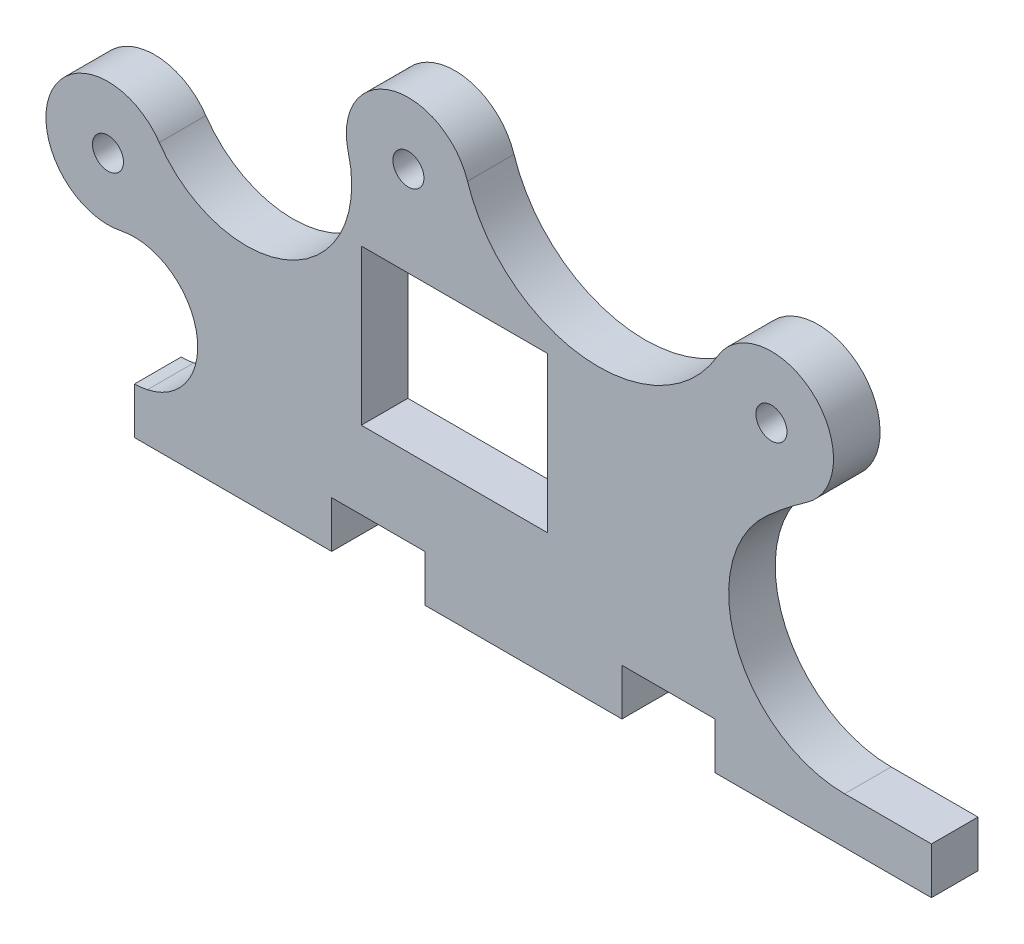
ISO-10303-21;
HEADER;
FILE_DESCRIPTION(('STEP AP214'),'2;1');
FILE_NAME('part.step','',(''),(''),'','','');
FILE_SCHEMA(('AUTOMOTIVE_DESIGN { 1 0 10303 214 1 1 1 1 }'));
ENDSEC;
DATA;
#1=APPLICATION_CONTEXT('core data for automotive mechanical design processes');
#2=APPLICATION_PROTOCOL_DEFINITION('international standard','automotive_design',2000,#1);
#3=PRODUCT_CONTEXT('',#1,'mechanical');
#4=PRODUCT('Part','Part','',(#3));
#5=PRODUCT_RELATED_PRODUCT_CATEGORY('part','',(#4));
#6=PRODUCT_DEFINITION_FORMATION('','',#4);
#7=PRODUCT_DEFINITION_CONTEXT('part definition',#1,'design');
#8=PRODUCT_DEFINITION('design','',#6,#7);
#9=PRODUCT_DEFINITION_SHAPE('','',#8);
#10=(LENGTH_UNIT() NAMED_UNIT(*) SI_UNIT(.MILLI.,.METRE.));
#11=(NAMED_UNIT(*) PLANE_ANGLE_UNIT() SI_UNIT($,.RADIAN.));
#12=(NAMED_UNIT(*) SI_UNIT($,.STERADIAN.) SOLID_ANGLE_UNIT());
#13=UNCERTAINTY_MEASURE_WITH_UNIT(LENGTH_MEASURE(1.E-05),#10,'distance_accuracy_value','');
#14=(GEOMETRIC_REPRESENTATION_CONTEXT(3) GLOBAL_UNCERTAINTY_ASSIGNED_CONTEXT((#13)) GLOBAL_UNIT_ASSIGNED_CONTEXT((#10,
#11,#12)) REPRESENTATION_CONTEXT('',''));
#15=CARTESIAN_POINT('',(0.,0.,0.));
#16=DIRECTION('',(0.,0.,1.));
#17=DIRECTION('',(1.,0.,0.));
#18=AXIS2_PLACEMENT_3D('',#15,#16,#17);
#19=CARTESIAN_POINT('',(-33.1668064947985,-1.04329319568763,-70.1366701519255));
#20=DIRECTION('',(0.,1.,0.));
#21=DIRECTION('',(0.,0.,1.));
#22=AXIS2_PLACEMENT_3D('',#19,#20,#21);
#23=PLANE('',#22);
#24=DIRECTION('',(-1.,0.,0.));
#25=VECTOR('',#24,1.);
#26=CARTESIAN_POINT('',(-33.1668064947985,-1.04329319568763,3.));
#27=LINE('',#26,#25);
#28=CARTESIAN_POINT('',(-4.30680649479845,-1.04329319568763,3.));
#29=VERTEX_POINT('',#28);
#30=CARTESIAN_POINT('',(-17.0068064947985,-1.04329319568765,3.));
#31=VERTEX_POINT('',#30);
#32=EDGE_CURVE('E286',#29,#31,#27,.T.);
#33=ORIENTED_EDGE('',*,*,#32,.T.);
#34=DIRECTION('',(0.,0.,1.));
#35=VECTOR('',#34,1.);
#36=CARTESIAN_POINT('',(-17.0068064947985,-1.04329319568765,-6.70820393249937));
#37=LINE('',#36,#35);
#38=CARTESIAN_POINT('',(-17.0068064947985,-1.04329319568763,0.));
#39=VERTEX_POINT('',#38);
#40=EDGE_CURVE('E293',#39,#31,#37,.T.);
#41=ORIENTED_EDGE('',*,*,#40,.F.);
#42=DIRECTION('',(1.,0.,0.));
#43=VECTOR('',#42,1.);
#44=CARTESIAN_POINT('',(-33.1668064947985,-1.04329319568763,0.));
#45=LINE('',#44,#43);
#46=CARTESIAN_POINT('',(-4.30680649479845,-1.04329319568763,0.));
#47=VERTEX_POINT('',#46);
#48=EDGE_CURVE('E349',#39,#47,#45,.T.);
#49=ORIENTED_EDGE('',*,*,#48,.T.);
#50=DIRECTION('',(0.,0.,1.));
#51=VECTOR('',#50,1.);
#52=CARTESIAN_POINT('',(-4.30680649479845,-1.04329319568763,-6.70820393249937));
#53=LINE('',#52,#51);
#54=EDGE_CURVE('E294',#47,#29,#53,.T.);
#55=ORIENTED_EDGE('',*,*,#54,.T.);
#56=EDGE_LOOP('',(#33,#41,#49,#55));
#57=FACE_BOUND('',#56,.T.);
#58=ADVANCED_FACE('F41',(#57),#23,.F.);
#59=CARTESIAN_POINT('',(14.3931935052015,-1.04329319568763,3.));
#60=VERTEX_POINT('',#59);
#61=CARTESIAN_POINT('',(1.69319350520155,-1.04329319568763,3.));
#62=VERTEX_POINT('',#61);
#63=EDGE_CURVE('E343',#60,#62,#27,.T.);
#64=ORIENTED_EDGE('',*,*,#63,.T.);
#65=DIRECTION('',(0.,0.,1.));
#66=VECTOR('',#65,1.);
#67=CARTESIAN_POINT('',(1.69319350520155,-1.04329319568763,-6.70820393249937));
#68=LINE('',#67,#66);
#69=CARTESIAN_POINT('',(1.69319350520155,-1.04329319568763,0.));
#70=VERTEX_POINT('',#69);
#71=EDGE_CURVE('E299',#70,#62,#68,.T.);
#72=ORIENTED_EDGE('',*,*,#71,.F.);
#73=CARTESIAN_POINT('',(14.3931935052015,-1.04329319568763,0.));
#74=VERTEX_POINT('',#73);
#75=EDGE_CURVE('E347',#70,#74,#45,.T.);
#76=ORIENTED_EDGE('',*,*,#75,.T.);
#77=DIRECTION('',(0.,0.,1.));
#78=VECTOR('',#77,1.);
#79=CARTESIAN_POINT('',(14.3931935052015,-1.04329319568763,-6.70820393249937));
#80=LINE('',#79,#78);
#81=EDGE_CURVE('E320',#74,#60,#80,.T.);
#82=ORIENTED_EDGE('',*,*,#81,.T.);
#83=EDGE_LOOP('',(#64,#72,#76,#82));
#84=FACE_BOUND('',#83,.T.);
#85=ADVANCED_FACE('F411',(#84),#23,.F.);
#86=CARTESIAN_POINT('',(4.23952793448515,6.7936617485186,3.));
#87=DIRECTION('',(0.,0.,1.));
#88=DIRECTION('',(1.,0.,0.));
#89=AXIS2_PLACEMENT_3D('',#86,#87,#88);
#90=PLANE('',#89);
#91=CARTESIAN_POINT('',(-17.0068064947985,5.91189813683881,3.));
#92=DIRECTION('',(0.,0.,1.));
#93=DIRECTION('',(1.,0.,0.));
#94=AXIS2_PLACEMENT_3D('',#91,#92,#93);
#95=CIRCLE('',#94,3.95519133252644);
#96=CARTESIAN_POINT('',(-17.0068064947985,1.95670680431237,3.));
#97=VERTEX_POINT('',#96);
#98=CARTESIAN_POINT('',(-16.1842593458128,2.04318327727784,3.));
#99=VERTEX_POINT('',#98);
#100=EDGE_CURVE('E237',#97,#99,#95,.T.);
#101=ORIENTED_EDGE('',*,*,#100,.F.);
#102=DIRECTION('',(0.,1.,0.));
#103=VECTOR('',#102,1.);
#104=CARTESIAN_POINT('',(-17.0068064947985,1.95670680431236,3.));
#105=LINE('',#104,#103);
#106=EDGE_CURVE('E289',#31,#97,#105,.T.);
#107=ORIENTED_EDGE('',*,*,#106,.F.);
#108=ORIENTED_EDGE('',*,*,#32,.F.);
#109=DIRECTION('',(0.,-1.,0.));
#110=VECTOR('',#109,1.);
#111=CARTESIAN_POINT('',(-4.30680649479845,-1.04329319568763,3.));
#112=LINE('',#111,#110);
#113=CARTESIAN_POINT('',(-4.30680649479845,1.95670680431235,3.));
#114=VERTEX_POINT('',#113);
#115=EDGE_CURVE('E292',#114,#29,#112,.T.);
#116=ORIENTED_EDGE('',*,*,#115,.F.);
#117=DIRECTION('',(-1.,0.,0.));
#118=VECTOR('',#117,1.);
#119=CARTESIAN_POINT('',(-4.30680649479845,1.95670680431235,3.));
#120=LINE('',#119,#118);
#121=CARTESIAN_POINT('',(1.69319350520155,1.95670680431235,3.));
#122=VERTEX_POINT('',#121);
#123=EDGE_CURVE('E296',#122,#114,#120,.T.);
#124=ORIENTED_EDGE('',*,*,#123,.F.);
#125=DIRECTION('',(0.,1.,0.));
#126=VECTOR('',#125,1.);
#127=CARTESIAN_POINT('',(1.69319350520155,-1.04329319568763,3.));
#128=LINE('',#127,#126);
#129=EDGE_CURVE('E310',#62,#122,#128,.T.);
#130=ORIENTED_EDGE('',*,*,#129,.F.);
#131=ORIENTED_EDGE('',*,*,#63,.F.);
#132=DIRECTION('',(0.,-1.,0.));
#133=VECTOR('',#132,1.);
#134=CARTESIAN_POINT('',(14.3931935052015,1.95670680431236,3.));
#135=LINE('',#134,#133);
#136=CARTESIAN_POINT('',(14.3931935052015,1.95670680431236,3.));
#137=VERTEX_POINT('',#136);
#138=EDGE_CURVE('E313',#137,#60,#135,.T.);
#139=ORIENTED_EDGE('',*,*,#138,.F.);
#140=DIRECTION('',(-1.,0.,0.));
#141=VECTOR('',#140,1.);
#142=CARTESIAN_POINT('',(14.3931935052015,1.95670680431236,3.));
#143=LINE('',#142,#141);
#144=CARTESIAN_POINT('',(20.3931935052015,1.95670680431236,3.));
#145=VERTEX_POINT('',#144);
#146=EDGE_CURVE('E318',#145,#137,#143,.T.);
#147=ORIENTED_EDGE('',*,*,#146,.F.);
#148=DIRECTION('',(0.,1.,0.));
#149=VECTOR('',#148,1.);
#150=CARTESIAN_POINT('',(20.3931935052015,1.95670680431236,3.));
#151=LINE('',#150,#149);
#152=CARTESIAN_POINT('',(20.3931935052015,-1.04329319568763,3.));
#153=VERTEX_POINT('',#152);
#154=EDGE_CURVE('E328',#153,#145,#151,.T.);
#155=ORIENTED_EDGE('',*,*,#154,.F.);
#156=CARTESIAN_POINT('',(34.3331935052015,-1.04329319568763,3.));
#157=VERTEX_POINT('',#156);
#158=EDGE_CURVE('E340',#157,#153,#27,.T.);
#159=ORIENTED_EDGE('',*,*,#158,.F.);
#160=DIRECTION('',(0.,-1.,0.));
#161=VECTOR('',#160,1.);
#162=CARTESIAN_POINT('',(34.3331935052015,-1.04329319568763,3.));
#163=LINE('',#162,#161);
#164=CARTESIAN_POINT('',(34.3331935052015,1.95670680431236,3.));
#165=VERTEX_POINT('',#164);
#166=EDGE_CURVE('E240',#165,#157,#163,.T.);
#167=ORIENTED_EDGE('',*,*,#166,.F.);
#168=DIRECTION('',(1.,0.,0.));
#169=VECTOR('',#168,1.);
#170=CARTESIAN_POINT('',(28.7361348728131,1.95670680431236,3.));
#171=LINE('',#170,#169);
#172=CARTESIAN_POINT('',(28.7361348728131,1.95670680431236,3.));
#173=VERTEX_POINT('',#172);
#174=EDGE_CURVE('E214',#173,#165,#171,.T.);
#175=ORIENTED_EDGE('',*,*,#174,.F.);
#176=CARTESIAN_POINT('',(28.7361348728131,9.42517249190362,3.));
#177=DIRECTION('',(0.,0.,1.));
#178=DIRECTION('',(1.,0.,0.));
#179=AXIS2_PLACEMENT_3D('',#176,#177,#178);
#180=CIRCLE('',#179,7.46846568759126);
#181=CARTESIAN_POINT('',(23.7497986370452,14.9852471919949,3.));
#182=VERTEX_POINT('',#181);
#183=EDGE_CURVE('E225',#182,#173,#180,.T.);
#184=ORIENTED_EDGE('',*,*,#183,.F.);
#185=CARTESIAN_POINT('',(41.2707770358813,-4.55173228753121,3.));
#186=DIRECTION('',(0.,0.,1.));
#187=DIRECTION('',(1.,0.,0.));
#188=AXIS2_PLACEMENT_3D('',#185,#186,#187);
#189=CIRCLE('',#188,26.2426799552925);
#190=CARTESIAN_POINT('',(26.3054250537757,17.0055516621596,3.));
#191=VERTEX_POINT('',#190);
#192=EDGE_CURVE('E222',#191,#182,#189,.T.);
#193=ORIENTED_EDGE('',*,*,#192,.F.);
#194=CARTESIAN_POINT('',(24.0243543692876,20.2913874055237,3.));
#195=DIRECTION('',(0.,0.,-1.));
#196=DIRECTION('',(1.,0.,0.));
#197=AXIS2_PLACEMENT_3D('',#194,#195,#196);
#198=CIRCLE('',#197,4.00000000000001);
#199=CARTESIAN_POINT('',(20.5599756734033,22.2909074108007,3.));
#200=VERTEX_POINT('',#199);
#201=EDGE_CURVE('E259',#200,#191,#198,.T.);
#202=ORIENTED_EDGE('',*,*,#201,.F.);
#203=CARTESIAN_POINT('',(12.8780736062123,26.7246365756218,3.));
#204=DIRECTION('',(0.,0.,1.));
#205=DIRECTION('',(1.,0.,0.));
#206=AXIS2_PLACEMENT_3D('',#203,#204,#205);
#207=CIRCLE('',#206,8.86958700712147);
#208=CARTESIAN_POINT('',(4.44027319157562,23.9909398404929,3.));
#209=VERTEX_POINT('',#208);
#210=EDGE_CURVE('E260',#209,#200,#207,.T.);
#211=ORIENTED_EDGE('',*,*,#210,.F.);
#212=CARTESIAN_POINT('',(0.635000000000001,22.7580992435478,3.));
#213=DIRECTION('',(0.,0.,-1.));
#214=DIRECTION('',(1.,0.,0.));
#215=AXIS2_PLACEMENT_3D('',#212,#213,#214);
#216=CIRCLE('',#215,4.);
#217=CARTESIAN_POINT('',(-3.23646279285086,21.7522285542585,3.));
#218=VERTEX_POINT('',#217);
#219=EDGE_CURVE('E251',#218,#209,#216,.T.);
#220=ORIENTED_EDGE('',*,*,#219,.F.);
#221=CARTESIAN_POINT('',(-9.80593700645944,20.045369439478,3.));
#222=DIRECTION('',(0.,0.,1.));
#223=DIRECTION('',(1.,0.,0.));
#224=AXIS2_PLACEMENT_3D('',#221,#222,#223);
#225=CIRCLE('',#224,6.7875886352207);
#226=CARTESIAN_POINT('',(-15.4147474005923,16.2227256627649,3.));
#227=VERTEX_POINT('',#226);
#228=EDGE_CURVE('E252',#227,#218,#225,.T.);
#229=ORIENTED_EDGE('',*,*,#228,.F.);
#230=CARTESIAN_POINT('',(-18.7200805287839,13.97,3.));
#231=DIRECTION('',(0.,0.,-1.));
#232=DIRECTION('',(1.,0.,0.));
#233=AXIS2_PLACEMENT_3D('',#230,#231,#232);
#234=CIRCLE('',#233,4.);
#235=CARTESIAN_POINT('',(-17.8882146797452,10.0574561715933,3.));
#236=VERTEX_POINT('',#235);
#237=EDGE_CURVE('E247',#236,#227,#234,.T.);
#238=ORIENTED_EDGE('',*,*,#237,.F.);
#239=CARTESIAN_POINT('',(-17.036237012779,6.05031972443559,3.));
#240=DIRECTION('',(0.,0.,1.));
#241=DIRECTION('',(1.,0.,0.));
#242=AXIS2_PLACEMENT_3D('',#239,#240,#241);
#243=CIRCLE('',#242,4.09670702530083);
#244=EDGE_CURVE('E244',#99,#236,#243,.T.);
#245=ORIENTED_EDGE('',*,*,#244,.F.);
#246=EDGE_LOOP('',(#101,#107,#108,#116,#124,#130,#131,#139,#147,#155,#159,#167,#175,#184,#193,
#202,#211,#220,#229,#238,#245));
#247=FACE_BOUND('',#246,.T.);
#248=CARTESIAN_POINT('',(0.635000000000001,22.7580992435478,3.));
#249=DIRECTION('',(0.,0.,1.));
#250=DIRECTION('',(1.,0.,0.));
#251=AXIS2_PLACEMENT_3D('',#248,#249,#250);
#252=CIRCLE('',#251,1.);
#253=CARTESIAN_POINT('',(1.635,22.7580992435478,3.));
#254=VERTEX_POINT('',#253);
#255=EDGE_CURVE('E390',#254,#254,#252,.T.);
#256=ORIENTED_EDGE('',*,*,#255,.F.);
#257=EDGE_LOOP('',(#256));
#258=FACE_BOUND('',#257,.T.);
#259=CARTESIAN_POINT('',(-18.7200805287839,13.97,3.));
#260=DIRECTION('',(0.,0.,1.));
#261=DIRECTION('',(1.,0.,0.));
#262=AXIS2_PLACEMENT_3D('',#259,#260,#261);
#263=CIRCLE('',#262,1.00000000000001);
#264=CARTESIAN_POINT('',(-17.7200805287839,13.97,3.));
#265=VERTEX_POINT('',#264);
#266=EDGE_CURVE('E11',#265,#265,#263,.T.);
#267=ORIENTED_EDGE('',*,*,#266,.F.);
#268=EDGE_LOOP('',(#267));
#269=FACE_BOUND('',#268,.T.);
#270=CARTESIAN_POINT('',(24.0243543692876,20.2913874055237,3.));
#271=DIRECTION('',(0.,0.,1.));
#272=DIRECTION('',(1.,0.,0.));
#273=AXIS2_PLACEMENT_3D('',#270,#271,#272);
#274=CIRCLE('',#273,0.999999999999987);
#275=CARTESIAN_POINT('',(25.0243543692876,20.2913874055237,3.));
#276=VERTEX_POINT('',#275);
#277=EDGE_CURVE('E382',#276,#276,#274,.T.);
#278=ORIENTED_EDGE('',*,*,#277,.F.);
#279=EDGE_LOOP('',(#278));
#280=FACE_BOUND('',#279,.T.);
#281=DIRECTION('',(1.,0.,0.));
#282=VECTOR('',#281,1.);
#283=CARTESIAN_POINT('',(-2.39922186799685,6.95398914964408,3.));
#284=LINE('',#283,#282);
#285=CARTESIAN_POINT('',(-2.39922186799685,6.95398914964408,3.));
#286=VERTEX_POINT('',#285);
#287=CARTESIAN_POINT('',(9.60077813200315,6.95398914964408,3.));
#288=VERTEX_POINT('',#287);
#289=EDGE_CURVE('E351',#286,#288,#284,.T.);
#290=ORIENTED_EDGE('',*,*,#289,.F.);
#291=DIRECTION('',(0.,-1.,0.));
#292=VECTOR('',#291,1.);
#293=CARTESIAN_POINT('',(-2.39922186799685,6.95398914964408,3.));
#294=LINE('',#293,#292);
#295=CARTESIAN_POINT('',(-2.39922186799685,16.9539891496441,3.));
#296=VERTEX_POINT('',#295);
#297=EDGE_CURVE('E348',#296,#286,#294,.T.);
#298=ORIENTED_EDGE('',*,*,#297,.F.);
#299=DIRECTION('',(-1.,0.,0.));
#300=VECTOR('',#299,1.);
#301=CARTESIAN_POINT('',(-2.39922186799685,16.9539891496441,3.));
#302=LINE('',#301,#300);
#303=CARTESIAN_POINT('',(9.60077813200315,16.9539891496441,3.));
#304=VERTEX_POINT('',#303);
#305=EDGE_CURVE('E357',#304,#296,#302,.T.);
#306=ORIENTED_EDGE('',*,*,#305,.F.);
#307=DIRECTION('',(0.,1.,0.));
#308=VECTOR('',#307,1.);
#309=CARTESIAN_POINT('',(9.60077813200315,6.95398914964408,3.));
#310=LINE('',#309,#308);
#311=EDGE_CURVE('E353',#288,#304,#310,.T.);
#312=ORIENTED_EDGE('',*,*,#311,.F.);
#313=EDGE_LOOP('',(#290,#298,#306,#312));
#314=FACE_BOUND('',#313,.T.);
#315=ADVANCED_FACE('F234',(#247,#258,#269,#280,#314),#90,.T.);
#316=CARTESIAN_POINT('',(4.23952793448515,6.7936617485186,0.));
#317=DIRECTION('',(0.,0.,1.));
#318=DIRECTION('',(1.,0.,0.));
#319=AXIS2_PLACEMENT_3D('',#316,#317,#318);
#320=PLANE('',#319);
#321=DIRECTION('',(0.,-1.,0.));
#322=VECTOR('',#321,1.);
#323=CARTESIAN_POINT('',(-17.0068064947985,1.95670680431236,0.));
#324=LINE('',#323,#322);
#325=CARTESIAN_POINT('',(-17.0068064947985,1.95670680431236,0.));
#326=VERTEX_POINT('',#325);
#327=EDGE_CURVE('E283',#326,#39,#324,.T.);
#328=ORIENTED_EDGE('',*,*,#327,.F.);
#329=CARTESIAN_POINT('',(-17.0068064947985,5.91189813683881,0.));
#330=DIRECTION('',(0.,0.,1.));
#331=DIRECTION('',(1.,0.,0.));
#332=AXIS2_PLACEMENT_3D('',#329,#330,#331);
#333=CIRCLE('',#332,3.95519133252644);
#334=CARTESIAN_POINT('',(-16.1842593458128,2.04318327727784,0.));
#335=VERTEX_POINT('',#334);
#336=EDGE_CURVE('E448',#335,#326,#333,.F.);
#337=ORIENTED_EDGE('',*,*,#336,.F.);
#338=CARTESIAN_POINT('',(-17.036237012779,6.05031972443559,0.));
#339=DIRECTION('',(0.,0.,1.));
#340=DIRECTION('',(1.,0.,0.));
#341=AXIS2_PLACEMENT_3D('',#338,#339,#340);
#342=CIRCLE('',#341,4.09670702530083);
#343=CARTESIAN_POINT('',(-17.8882146797452,10.0574561715933,0.));
#344=VERTEX_POINT('',#343);
#345=EDGE_CURVE('E455',#344,#335,#342,.F.);
#346=ORIENTED_EDGE('',*,*,#345,.F.);
#347=CARTESIAN_POINT('',(-18.7200805287839,13.97,0.));
#348=DIRECTION('',(0.,0.,1.));
#349=DIRECTION('',(1.,0.,0.));
#350=AXIS2_PLACEMENT_3D('',#347,#348,#349);
#351=CIRCLE('',#350,4.);
#352=CARTESIAN_POINT('',(-15.4147474005923,16.2227256627649,0.));
#353=VERTEX_POINT('',#352);
#354=EDGE_CURVE('E456',#353,#344,#351,.T.);
#355=ORIENTED_EDGE('',*,*,#354,.F.);
#356=CARTESIAN_POINT('',(-9.80593700645944,20.045369439478,0.));
#357=DIRECTION('',(0.,0.,1.));
#358=DIRECTION('',(1.,0.,0.));
#359=AXIS2_PLACEMENT_3D('',#356,#357,#358);
#360=CIRCLE('',#359,6.7875886352207);
#361=CARTESIAN_POINT('',(-3.23646279285086,21.7522285542585,0.));
#362=VERTEX_POINT('',#361);
#363=EDGE_CURVE('E459',#362,#353,#360,.F.);
#364=ORIENTED_EDGE('',*,*,#363,.F.);
#365=CARTESIAN_POINT('',(0.635000000000001,22.7580992435478,0.));
#366=DIRECTION('',(0.,0.,1.));
#367=DIRECTION('',(1.,0.,0.));
#368=AXIS2_PLACEMENT_3D('',#365,#366,#367);
#369=CIRCLE('',#368,4.);
#370=CARTESIAN_POINT('',(4.44027319157563,23.9909398404929,0.));
#371=VERTEX_POINT('',#370);
#372=EDGE_CURVE('E460',#371,#362,#369,.T.);
#373=ORIENTED_EDGE('',*,*,#372,.F.);
#374=CARTESIAN_POINT('',(12.8780736062123,26.7246365756218,0.));
#375=DIRECTION('',(0.,0.,1.));
#376=DIRECTION('',(1.,0.,0.));
#377=AXIS2_PLACEMENT_3D('',#374,#375,#376);
#378=CIRCLE('',#377,8.86958700712147);
#379=CARTESIAN_POINT('',(20.5599756734033,22.2909074108007,0.));
#380=VERTEX_POINT('',#379);
#381=EDGE_CURVE('E462',#380,#371,#378,.F.);
#382=ORIENTED_EDGE('',*,*,#381,.F.);
#383=CARTESIAN_POINT('',(24.0243543692876,20.2913874055237,0.));
#384=DIRECTION('',(0.,0.,1.));
#385=DIRECTION('',(1.,0.,0.));
#386=AXIS2_PLACEMENT_3D('',#383,#384,#385);
#387=CIRCLE('',#386,4.00000000000001);
#388=CARTESIAN_POINT('',(26.3054250537757,17.0055516621596,0.));
#389=VERTEX_POINT('',#388);
#390=EDGE_CURVE('E463',#389,#380,#387,.T.);
#391=ORIENTED_EDGE('',*,*,#390,.F.);
#392=CARTESIAN_POINT('',(41.2707770358813,-4.55173228753121,0.));
#393=DIRECTION('',(0.,0.,1.));
#394=DIRECTION('',(1.,0.,0.));
#395=AXIS2_PLACEMENT_3D('',#392,#393,#394);
#396=CIRCLE('',#395,26.2426799552925);
#397=CARTESIAN_POINT('',(23.7497986370452,14.9852471919949,0.));
#398=VERTEX_POINT('',#397);
#399=EDGE_CURVE('E467',#398,#389,#396,.F.);
#400=ORIENTED_EDGE('',*,*,#399,.F.);
#401=CARTESIAN_POINT('',(28.7361348728131,9.42517249190362,0.));
#402=DIRECTION('',(0.,0.,1.));
#403=DIRECTION('',(1.,0.,0.));
#404=AXIS2_PLACEMENT_3D('',#401,#402,#403);
#405=CIRCLE('',#404,7.46846568759126);
#406=CARTESIAN_POINT('',(28.7361348728131,1.95670680431236,0.));
#407=VERTEX_POINT('',#406);
#408=EDGE_CURVE('E284',#407,#398,#405,.F.);
#409=ORIENTED_EDGE('',*,*,#408,.F.);
#410=DIRECTION('',(-1.,0.,0.));
#411=VECTOR('',#410,1.);
#412=CARTESIAN_POINT('',(28.7361348728131,1.95670680431236,0.));
#413=LINE('',#412,#411);
#414=CARTESIAN_POINT('',(34.3331935052015,1.95670680431236,0.));
#415=VERTEX_POINT('',#414);
#416=EDGE_CURVE('E219',#415,#407,#413,.T.);
#417=ORIENTED_EDGE('',*,*,#416,.F.);
#418=DIRECTION('',(0.,1.,0.));
#419=VECTOR('',#418,1.);
#420=CARTESIAN_POINT('',(34.3331935052015,-1.04329319568763,0.));
#421=LINE('',#420,#419);
#422=CARTESIAN_POINT('',(34.3331935052015,-1.04329319568763,0.));
#423=VERTEX_POINT('',#422);
#424=EDGE_CURVE('E265',#423,#415,#421,.T.);
#425=ORIENTED_EDGE('',*,*,#424,.F.);
#426=CARTESIAN_POINT('',(20.3931935052015,-1.04329319568763,0.));
#427=VERTEX_POINT('',#426);
#428=EDGE_CURVE('E342',#427,#423,#45,.T.);
#429=ORIENTED_EDGE('',*,*,#428,.F.);
#430=DIRECTION('',(0.,-1.,0.));
#431=VECTOR('',#430,1.);
#432=CARTESIAN_POINT('',(20.3931935052015,1.95670680431236,0.));
#433=LINE('',#432,#431);
#434=CARTESIAN_POINT('',(20.3931935052015,1.95670680431236,0.));
#435=VERTEX_POINT('',#434);
#436=EDGE_CURVE('E57',#435,#427,#433,.T.);
#437=ORIENTED_EDGE('',*,*,#436,.F.);
#438=DIRECTION('',(1.,0.,0.));
#439=VECTOR('',#438,1.);
#440=CARTESIAN_POINT('',(14.3931935052015,1.95670680431236,0.));
#441=LINE('',#440,#439);
#442=CARTESIAN_POINT('',(14.3931935052015,1.95670680431236,0.));
#443=VERTEX_POINT('',#442);
#444=EDGE_CURVE('E333',#443,#435,#441,.T.);
#445=ORIENTED_EDGE('',*,*,#444,.F.);
#446=DIRECTION('',(0.,1.,0.));
#447=VECTOR('',#446,1.);
#448=CARTESIAN_POINT('',(14.3931935052015,1.95670680431236,0.));
#449=LINE('',#448,#447);
#450=EDGE_CURVE('E282',#74,#443,#449,.T.);
#451=ORIENTED_EDGE('',*,*,#450,.F.);
#452=ORIENTED_EDGE('',*,*,#75,.F.);
#453=DIRECTION('',(0.,-1.,0.));
#454=VECTOR('',#453,1.);
#455=CARTESIAN_POINT('',(1.69319350520155,-1.04329319568763,0.));
#456=LINE('',#455,#454);
#457=CARTESIAN_POINT('',(1.69319350520155,1.95670680431235,0.));
#458=VERTEX_POINT('',#457);
#459=EDGE_CURVE('E62',#458,#70,#456,.T.);
#460=ORIENTED_EDGE('',*,*,#459,.F.);
#461=DIRECTION('',(1.,0.,0.));
#462=VECTOR('',#461,1.);
#463=CARTESIAN_POINT('',(-4.30680649479845,1.95670680431235,0.));
#464=LINE('',#463,#462);
#465=CARTESIAN_POINT('',(-4.30680649479845,1.95670680431235,0.));
#466=VERTEX_POINT('',#465);
#467=EDGE_CURVE('E312',#466,#458,#464,.T.);
#468=ORIENTED_EDGE('',*,*,#467,.F.);
#469=DIRECTION('',(0.,1.,0.));
#470=VECTOR('',#469,1.);
#471=CARTESIAN_POINT('',(-4.30680649479845,-1.04329319568763,0.));
#472=LINE('',#471,#470);
#473=EDGE_CURVE('E311',#47,#466,#472,.T.);
#474=ORIENTED_EDGE('',*,*,#473,.F.);
#475=ORIENTED_EDGE('',*,*,#48,.F.);
#476=EDGE_LOOP('',(#328,#337,#346,#355,#364,#373,#382,#391,#400,#409,#417,#425,#429,#437,#445,
#451,#452,#460,#468,#474,#475));
#477=FACE_BOUND('',#476,.T.);
#478=CARTESIAN_POINT('',(24.0243543692876,20.2913874055237,0.));
#479=DIRECTION('',(0.,0.,1.));
#480=DIRECTION('',(1.,0.,0.));
#481=AXIS2_PLACEMENT_3D('',#478,#479,#480);
#482=CIRCLE('',#481,0.999999999999987);
#483=CARTESIAN_POINT('',(25.0243543692876,20.2913874055237,0.));
#484=VERTEX_POINT('',#483);
#485=EDGE_CURVE('E379',#484,#484,#482,.T.);
#486=ORIENTED_EDGE('',*,*,#485,.T.);
#487=EDGE_LOOP('',(#486));
#488=FACE_BOUND('',#487,.T.);
#489=CARTESIAN_POINT('',(0.635000000000001,22.7580992435478,0.));
#490=DIRECTION('',(0.,0.,1.));
#491=DIRECTION('',(1.,0.,0.));
#492=AXIS2_PLACEMENT_3D('',#489,#490,#491);
#493=CIRCLE('',#492,1.);
#494=CARTESIAN_POINT('',(1.635,22.7580992435478,0.));
#495=VERTEX_POINT('',#494);
#496=EDGE_CURVE('E381',#495,#495,#493,.T.);
#497=ORIENTED_EDGE('',*,*,#496,.T.);
#498=EDGE_LOOP('',(#497));
#499=FACE_BOUND('',#498,.T.);
#500=CARTESIAN_POINT('',(-18.7200805287839,13.97,0.));
#501=DIRECTION('',(0.,0.,1.));
#502=DIRECTION('',(1.,0.,0.));
#503=AXIS2_PLACEMENT_3D('',#500,#501,#502);
#504=CIRCLE('',#503,1.00000000000001);
#505=CARTESIAN_POINT('',(-17.7200805287839,13.97,0.));
#506=VERTEX_POINT('',#505);
#507=EDGE_CURVE('E44',#506,#506,#504,.T.);
#508=ORIENTED_EDGE('',*,*,#507,.T.);
#509=EDGE_LOOP('',(#508));
#510=FACE_BOUND('',#509,.T.);
#511=DIRECTION('',(0.,-1.,0.));
#512=VECTOR('',#511,1.);
#513=CARTESIAN_POINT('',(-2.39922186799685,6.95398914964408,0.));
#514=LINE('',#513,#512);
#515=CARTESIAN_POINT('',(-2.39922186799685,16.9539891496441,0.));
#516=VERTEX_POINT('',#515);
#517=CARTESIAN_POINT('',(-2.39922186799685,6.95398914964408,0.));
#518=VERTEX_POINT('',#517);
#519=EDGE_CURVE('E359',#516,#518,#514,.T.);
#520=ORIENTED_EDGE('',*,*,#519,.T.);
#521=DIRECTION('',(1.,0.,0.));
#522=VECTOR('',#521,1.);
#523=CARTESIAN_POINT('',(-2.39922186799685,6.95398914964408,0.));
#524=LINE('',#523,#522);
#525=CARTESIAN_POINT('',(9.60077813200315,6.95398914964408,0.));
#526=VERTEX_POINT('',#525);
#527=EDGE_CURVE('E361',#518,#526,#524,.T.);
#528=ORIENTED_EDGE('',*,*,#527,.T.);
#529=DIRECTION('',(0.,1.,0.));
#530=VECTOR('',#529,1.);
#531=CARTESIAN_POINT('',(9.60077813200315,6.95398914964408,0.));
#532=LINE('',#531,#530);
#533=CARTESIAN_POINT('',(9.60077813200315,16.9539891496441,0.));
#534=VERTEX_POINT('',#533);
#535=EDGE_CURVE('E366',#526,#534,#532,.T.);
#536=ORIENTED_EDGE('',*,*,#535,.T.);
#537=DIRECTION('',(-1.,0.,0.));
#538=VECTOR('',#537,1.);
#539=CARTESIAN_POINT('',(-2.39922186799685,16.9539891496441,0.));
#540=LINE('',#539,#538);
#541=EDGE_CURVE('E352',#534,#516,#540,.T.);
#542=ORIENTED_EDGE('',*,*,#541,.T.);
#543=EDGE_LOOP('',(#520,#528,#536,#542));
#544=FACE_BOUND('',#543,.T.);
#545=ADVANCED_FACE('F43',(#477,#488,#499,#510,#544),#320,.F.);
#546=CARTESIAN_POINT('',(-18.7200805287839,13.97,3.));
#547=DIRECTION('',(0.,0.,-1.));
#548=DIRECTION('',(-1.,0.,0.));
#549=AXIS2_PLACEMENT_3D('',#546,#547,#548);
#550=CYLINDRICAL_SURFACE('',#549,1.00000000000001);
#551=ORIENTED_EDGE('',*,*,#266,.T.);
#552=EDGE_LOOP('',(#551));
#553=FACE_BOUND('',#552,.T.);
#554=ORIENTED_EDGE('',*,*,#507,.F.);
#555=EDGE_LOOP('',(#554));
#556=FACE_BOUND('',#555,.T.);
#557=ADVANCED_FACE('F399',(#553,#556),#550,.F.);
#558=CARTESIAN_POINT('',(0.635000000000001,22.7580992435478,3.));
#559=DIRECTION('',(0.,0.,-1.));
#560=DIRECTION('',(-1.,0.,0.));
#561=AXIS2_PLACEMENT_3D('',#558,#559,#560);
#562=CYLINDRICAL_SURFACE('',#561,1.);
#563=ORIENTED_EDGE('',*,*,#255,.T.);
#564=EDGE_LOOP('',(#563));
#565=FACE_BOUND('',#564,.T.);
#566=ORIENTED_EDGE('',*,*,#496,.F.);
#567=EDGE_LOOP('',(#566));
#568=FACE_BOUND('',#567,.T.);
#569=ADVANCED_FACE('F395',(#565,#568),#562,.F.);
#570=CARTESIAN_POINT('',(24.0243543692876,20.2913874055237,3.));
#571=DIRECTION('',(0.,0.,-1.));
#572=DIRECTION('',(-1.,0.,0.));
#573=AXIS2_PLACEMENT_3D('',#570,#571,#572);
#574=CYLINDRICAL_SURFACE('',#573,0.999999999999987);
#575=ORIENTED_EDGE('',*,*,#277,.T.);
#576=EDGE_LOOP('',(#575));
#577=FACE_BOUND('',#576,.T.);
#578=ORIENTED_EDGE('',*,*,#485,.F.);
#579=EDGE_LOOP('',(#578));
#580=FACE_BOUND('',#579,.T.);
#581=ADVANCED_FACE('F397',(#577,#580),#574,.F.);
#582=CARTESIAN_POINT('',(-2.39922186799685,6.95398914964408,3.));
#583=DIRECTION('',(1.,0.,0.));
#584=DIRECTION('',(0.,1.,0.));
#585=AXIS2_PLACEMENT_3D('',#582,#583,#584);
#586=PLANE('',#585);
#587=ORIENTED_EDGE('',*,*,#519,.F.);
#588=DIRECTION('',(0.,0.,-1.));
#589=VECTOR('',#588,1.);
#590=CARTESIAN_POINT('',(-2.39922186799685,16.9539891496441,3.));
#591=LINE('',#590,#589);
#592=EDGE_CURVE('E360',#296,#516,#591,.T.);
#593=ORIENTED_EDGE('',*,*,#592,.F.);
#594=ORIENTED_EDGE('',*,*,#297,.T.);
#595=DIRECTION('',(0.,0.,-1.));
#596=VECTOR('',#595,1.);
#597=CARTESIAN_POINT('',(-2.39922186799685,6.95398914964408,3.));
#598=LINE('',#597,#596);
#599=EDGE_CURVE('E380',#286,#518,#598,.T.);
#600=ORIENTED_EDGE('',*,*,#599,.T.);
#601=EDGE_LOOP('',(#587,#593,#594,#600));
#602=FACE_BOUND('',#601,.T.);
#603=ADVANCED_FACE('F403',(#602),#586,.T.);
#604=CARTESIAN_POINT('',(-2.39922186799685,6.95398914964408,3.));
#605=DIRECTION('',(0.,1.,0.));
#606=DIRECTION('',(0.,0.,1.));
#607=AXIS2_PLACEMENT_3D('',#604,#605,#606);
#608=PLANE('',#607);
#609=ORIENTED_EDGE('',*,*,#527,.F.);
#610=ORIENTED_EDGE('',*,*,#599,.F.);
#611=ORIENTED_EDGE('',*,*,#289,.T.);
#612=DIRECTION('',(0.,0.,-1.));
#613=VECTOR('',#612,1.);
#614=CARTESIAN_POINT('',(9.60077813200315,6.95398914964408,3.));
#615=LINE('',#614,#613);
#616=EDGE_CURVE('E374',#288,#526,#615,.T.);
#617=ORIENTED_EDGE('',*,*,#616,.T.);
#618=EDGE_LOOP('',(#609,#610,#611,#617));
#619=FACE_BOUND('',#618,.T.);
#620=ADVANCED_FACE('F699',(#619),#608,.T.);
#621=CARTESIAN_POINT('',(9.60077813200315,6.95398914964408,3.));
#622=DIRECTION('',(-1.,0.,0.));
#623=DIRECTION('',(0.,0.,1.));
#624=AXIS2_PLACEMENT_3D('',#621,#622,#623);
#625=PLANE('',#624);
#626=ORIENTED_EDGE('',*,*,#535,.F.);
#627=ORIENTED_EDGE('',*,*,#616,.F.);
#628=ORIENTED_EDGE('',*,*,#311,.T.);
#629=DIRECTION('',(0.,0.,-1.));
#630=VECTOR('',#629,1.);
#631=CARTESIAN_POINT('',(9.60077813200315,16.9539891496441,3.));
#632=LINE('',#631,#630);
#633=EDGE_CURVE('E373',#304,#534,#632,.T.);
#634=ORIENTED_EDGE('',*,*,#633,.T.);
#635=EDGE_LOOP('',(#626,#627,#628,#634));
#636=FACE_BOUND('',#635,.T.);
#637=ADVANCED_FACE('F434',(#636),#625,.T.);
#638=CARTESIAN_POINT('',(-2.39922186799685,16.9539891496441,3.));
#639=DIRECTION('',(0.,-1.,0.));
#640=DIRECTION('',(1.,0.,0.));
#641=AXIS2_PLACEMENT_3D('',#638,#639,#640);
#642=PLANE('',#641);
#643=ORIENTED_EDGE('',*,*,#541,.F.);
#644=ORIENTED_EDGE('',*,*,#633,.F.);
#645=ORIENTED_EDGE('',*,*,#305,.T.);
#646=ORIENTED_EDGE('',*,*,#592,.T.);
#647=EDGE_LOOP('',(#643,#644,#645,#646));
#648=FACE_BOUND('',#647,.T.);
#649=ADVANCED_FACE('F424',(#648),#642,.T.);
#650=ORIENTED_EDGE('',*,*,#158,.T.);
#651=DIRECTION('',(0.,0.,1.));
#652=VECTOR('',#651,1.);
#653=CARTESIAN_POINT('',(20.3931935052015,-1.04329319568763,-6.70820393249937));
#654=LINE('',#653,#652);
#655=EDGE_CURVE('E323',#427,#153,#654,.T.);
#656=ORIENTED_EDGE('',*,*,#655,.F.);
#657=ORIENTED_EDGE('',*,*,#428,.T.);
#658=DIRECTION('',(0.,0.,1.));
#659=VECTOR('',#658,1.);
#660=CARTESIAN_POINT('',(34.3331935052015,-1.04329319568763,-70.1366701519255));
#661=LINE('',#660,#659);
#662=EDGE_CURVE('E338',#423,#157,#661,.T.);
#663=ORIENTED_EDGE('',*,*,#662,.T.);
#664=EDGE_LOOP('',(#650,#656,#657,#663));
#665=FACE_BOUND('',#664,.T.);
#666=ADVANCED_FACE('F413',(#665),#23,.F.);
#667=CARTESIAN_POINT('',(14.3931935052015,1.95670680431236,-6.70820393249937));
#668=DIRECTION('',(-1.,0.,0.));
#669=DIRECTION('',(0.,-1.,0.));
#670=AXIS2_PLACEMENT_3D('',#667,#668,#669);
#671=PLANE('',#670);
#672=ORIENTED_EDGE('',*,*,#450,.T.);
#673=DIRECTION('',(0.,0.,1.));
#674=VECTOR('',#673,1.);
#675=CARTESIAN_POINT('',(14.3931935052015,1.95670680431236,-6.70820393249937));
#676=LINE('',#675,#674);
#677=EDGE_CURVE('E324',#443,#137,#676,.T.);
#678=ORIENTED_EDGE('',*,*,#677,.T.);
#679=ORIENTED_EDGE('',*,*,#138,.T.);
#680=ORIENTED_EDGE('',*,*,#81,.F.);
#681=EDGE_LOOP('',(#672,#678,#679,#680));
#682=FACE_BOUND('',#681,.T.);
#683=ADVANCED_FACE('F425',(#682),#671,.F.);
#684=CARTESIAN_POINT('',(14.3931935052015,1.95670680431236,-6.70820393249937));
#685=DIRECTION('',(0.,1.,0.));
#686=DIRECTION('',(-1.,0.,0.));
#687=AXIS2_PLACEMENT_3D('',#684,#685,#686);
#688=PLANE('',#687);
#689=ORIENTED_EDGE('',*,*,#444,.T.);
#690=DIRECTION('',(0.,0.,1.));
#691=VECTOR('',#690,1.);
#692=CARTESIAN_POINT('',(20.3931935052015,1.95670680431236,-6.70820393249937));
#693=LINE('',#692,#691);
#694=EDGE_CURVE('E321',#435,#145,#693,.T.);
#695=ORIENTED_EDGE('',*,*,#694,.T.);
#696=ORIENTED_EDGE('',*,*,#146,.T.);
#697=ORIENTED_EDGE('',*,*,#677,.F.);
#698=EDGE_LOOP('',(#689,#695,#696,#697));
#699=FACE_BOUND('',#698,.T.);
#700=ADVANCED_FACE('F435',(#699),#688,.F.);
#701=CARTESIAN_POINT('',(20.3931935052015,1.95670680431236,-6.70820393249937));
#702=DIRECTION('',(1.,0.,0.));
#703=DIRECTION('',(0.,0.,-1.));
#704=AXIS2_PLACEMENT_3D('',#701,#702,#703);
#705=PLANE('',#704);
#706=ORIENTED_EDGE('',*,*,#436,.T.);
#707=ORIENTED_EDGE('',*,*,#655,.T.);
#708=ORIENTED_EDGE('',*,*,#154,.T.);
#709=ORIENTED_EDGE('',*,*,#694,.F.);
#710=EDGE_LOOP('',(#706,#707,#708,#709));
#711=FACE_BOUND('',#710,.T.);
#712=ADVANCED_FACE('F441',(#711),#705,.F.);
#713=CARTESIAN_POINT('',(-4.30680649479845,-1.04329319568763,-6.70820393249937));
#714=DIRECTION('',(-1.,0.,0.));
#715=DIRECTION('',(0.,-1.,0.));
#716=AXIS2_PLACEMENT_3D('',#713,#714,#715);
#717=PLANE('',#716);
#718=ORIENTED_EDGE('',*,*,#473,.T.);
#719=DIRECTION('',(0.,0.,1.));
#720=VECTOR('',#719,1.);
#721=CARTESIAN_POINT('',(-4.30680649479845,1.95670680431235,-6.70820393249937));
#722=LINE('',#721,#720);
#723=EDGE_CURVE('E303',#466,#114,#722,.T.);
#724=ORIENTED_EDGE('',*,*,#723,.T.);
#725=ORIENTED_EDGE('',*,*,#115,.T.);
#726=ORIENTED_EDGE('',*,*,#54,.F.);
#727=EDGE_LOOP('',(#718,#724,#725,#726));
#728=FACE_BOUND('',#727,.T.);
#729=ADVANCED_FACE('F524',(#728),#717,.F.);
#730=CARTESIAN_POINT('',(-4.30680649479845,1.95670680431235,-6.70820393249937));
#731=DIRECTION('',(0.,1.,0.));
#732=DIRECTION('',(-1.,0.,0.));
#733=AXIS2_PLACEMENT_3D('',#730,#731,#732);
#734=PLANE('',#733);
#735=ORIENTED_EDGE('',*,*,#467,.T.);
#736=DIRECTION('',(0.,0.,1.));
#737=VECTOR('',#736,1.);
#738=CARTESIAN_POINT('',(1.69319350520155,1.95670680431235,-6.70820393249937));
#739=LINE('',#738,#737);
#740=EDGE_CURVE('E301',#458,#122,#739,.T.);
#741=ORIENTED_EDGE('',*,*,#740,.T.);
#742=ORIENTED_EDGE('',*,*,#123,.T.);
#743=ORIENTED_EDGE('',*,*,#723,.F.);
#744=EDGE_LOOP('',(#735,#741,#742,#743));
#745=FACE_BOUND('',#744,.T.);
#746=ADVANCED_FACE('F526',(#745),#734,.F.);
#747=CARTESIAN_POINT('',(1.69319350520155,-1.04329319568763,-6.70820393249937));
#748=DIRECTION('',(1.,0.,0.));
#749=DIRECTION('',(0.,1.,0.));
#750=AXIS2_PLACEMENT_3D('',#747,#748,#749);
#751=PLANE('',#750);
#752=ORIENTED_EDGE('',*,*,#459,.T.);
#753=ORIENTED_EDGE('',*,*,#71,.T.);
#754=ORIENTED_EDGE('',*,*,#129,.T.);
#755=ORIENTED_EDGE('',*,*,#740,.F.);
#756=EDGE_LOOP('',(#752,#753,#754,#755));
#757=FACE_BOUND('',#756,.T.);
#758=ADVANCED_FACE('F527',(#757),#751,.F.);
#759=CARTESIAN_POINT('',(-17.0068064947985,1.95670680431236,-6.70820393249937));
#760=DIRECTION('',(1.,0.,0.));
#761=DIRECTION('',(0.,0.,-1.));
#762=AXIS2_PLACEMENT_3D('',#759,#760,#761);
#763=PLANE('',#762);
#764=ORIENTED_EDGE('',*,*,#327,.T.);
#765=ORIENTED_EDGE('',*,*,#40,.T.);
#766=ORIENTED_EDGE('',*,*,#106,.T.);
#767=DIRECTION('',(0.,0.,1.));
#768=VECTOR('',#767,1.);
#769=CARTESIAN_POINT('',(-17.0068064947985,1.95670680431236,-6.70820393249937));
#770=LINE('',#769,#768);
#771=EDGE_CURVE('E287',#326,#97,#770,.T.);
#772=ORIENTED_EDGE('',*,*,#771,.F.);
#773=EDGE_LOOP('',(#764,#765,#766,#772));
#774=FACE_BOUND('',#773,.T.);
#775=ADVANCED_FACE('F510',(#774),#763,.F.);
#776=CARTESIAN_POINT('',(34.3331935052015,-1.04329319568763,-86.5091147924296));
#777=DIRECTION('',(-1.,0.,0.));
#778=DIRECTION('',(0.,0.,1.));
#779=AXIS2_PLACEMENT_3D('',#776,#777,#778);
#780=PLANE('',#779);
#781=ORIENTED_EDGE('',*,*,#424,.T.);
#782=DIRECTION('',(0.,0.,1.));
#783=VECTOR('',#782,1.);
#784=CARTESIAN_POINT('',(34.3331935052015,1.95670680431236,-86.5091147924296));
#785=LINE('',#784,#783);
#786=EDGE_CURVE('E221',#415,#165,#785,.T.);
#787=ORIENTED_EDGE('',*,*,#786,.T.);
#788=ORIENTED_EDGE('',*,*,#166,.T.);
#789=ORIENTED_EDGE('',*,*,#662,.F.);
#790=EDGE_LOOP('',(#781,#787,#788,#789));
#791=FACE_BOUND('',#790,.T.);
#792=ADVANCED_FACE('F534',(#791),#780,.F.);
#793=CARTESIAN_POINT('',(28.7361348728131,9.42517249190362,-86.5091147924296));
#794=DIRECTION('',(0.,0.,1.));
#795=DIRECTION('',(1.,0.,0.));
#796=AXIS2_PLACEMENT_3D('',#793,#794,#795);
#797=CYLINDRICAL_SURFACE('',#796,7.46846568759126);
#798=ORIENTED_EDGE('',*,*,#408,.T.);
#799=DIRECTION('',(0.,0.,1.));
#800=VECTOR('',#799,1.);
#801=CARTESIAN_POINT('',(23.7497986370452,14.9852471919949,-86.5091147924296));
#802=LINE('',#801,#800);
#803=EDGE_CURVE('E226',#398,#182,#802,.T.);
#804=ORIENTED_EDGE('',*,*,#803,.T.);
#805=ORIENTED_EDGE('',*,*,#183,.T.);
#806=DIRECTION('',(0.,0.,1.));
#807=VECTOR('',#806,1.);
#808=CARTESIAN_POINT('',(28.7361348728131,1.95670680431236,-86.5091147924296));
#809=LINE('',#808,#807);
#810=EDGE_CURVE('E208',#407,#173,#809,.T.);
#811=ORIENTED_EDGE('',*,*,#810,.F.);
#812=EDGE_LOOP('',(#798,#804,#805,#811));
#813=FACE_BOUND('',#812,.T.);
#814=ADVANCED_FACE('F228',(#813),#797,.F.);
#815=CARTESIAN_POINT('',(41.2707770358813,-4.55173228753121,-86.5091147924296));
#816=DIRECTION('',(0.,0.,1.));
#817=DIRECTION('',(1.,0.,0.));
#818=AXIS2_PLACEMENT_3D('',#815,#816,#817);
#819=CYLINDRICAL_SURFACE('',#818,26.2426799552925);
#820=ORIENTED_EDGE('',*,*,#399,.T.);
#821=DIRECTION('',(0.,0.,1.));
#822=VECTOR('',#821,1.);
#823=CARTESIAN_POINT('',(26.3054250537757,17.0055516621596,-86.5091147924296));
#824=LINE('',#823,#822);
#825=EDGE_CURVE('E266',#389,#191,#824,.T.);
#826=ORIENTED_EDGE('',*,*,#825,.T.);
#827=ORIENTED_EDGE('',*,*,#192,.T.);
#828=ORIENTED_EDGE('',*,*,#803,.F.);
#829=EDGE_LOOP('',(#820,#826,#827,#828));
#830=FACE_BOUND('',#829,.T.);
#831=ADVANCED_FACE('F469',(#830),#819,.F.);
#832=CARTESIAN_POINT('',(24.0243543692876,20.2913874055237,-86.5091147924296));
#833=DIRECTION('',(0.,0.,1.));
#834=DIRECTION('',(1.,0.,0.));
#835=AXIS2_PLACEMENT_3D('',#832,#833,#834);
#836=CYLINDRICAL_SURFACE('',#835,4.00000000000001);
#837=ORIENTED_EDGE('',*,*,#390,.T.);
#838=DIRECTION('',(0.,0.,1.));
#839=VECTOR('',#838,1.);
#840=CARTESIAN_POINT('',(20.5599756734033,22.2909074108007,-86.5091147924296));
#841=LINE('',#840,#839);
#842=EDGE_CURVE('E269',#380,#200,#841,.T.);
#843=ORIENTED_EDGE('',*,*,#842,.T.);
#844=ORIENTED_EDGE('',*,*,#201,.T.);
#845=ORIENTED_EDGE('',*,*,#825,.F.);
#846=EDGE_LOOP('',(#837,#843,#844,#845));
#847=FACE_BOUND('',#846,.T.);
#848=ADVANCED_FACE('F476',(#847),#836,.T.);
#849=CARTESIAN_POINT('',(12.8780736062123,26.7246365756218,-86.5091147924296));
#850=DIRECTION('',(0.,0.,1.));
#851=DIRECTION('',(1.,0.,0.));
#852=AXIS2_PLACEMENT_3D('',#849,#850,#851);
#853=CYLINDRICAL_SURFACE('',#852,8.86958700712147);
#854=ORIENTED_EDGE('',*,*,#381,.T.);
#855=DIRECTION('',(0.,0.,1.));
#856=VECTOR('',#855,1.);
#857=CARTESIAN_POINT('',(4.44027319157562,23.9909398404929,-86.5091147924296));
#858=LINE('',#857,#856);
#859=EDGE_CURVE('E270',#371,#209,#858,.T.);
#860=ORIENTED_EDGE('',*,*,#859,.T.);
#861=ORIENTED_EDGE('',*,*,#210,.T.);
#862=ORIENTED_EDGE('',*,*,#842,.F.);
#863=EDGE_LOOP('',(#854,#860,#861,#862));
#864=FACE_BOUND('',#863,.T.);
#865=ADVANCED_FACE('F479',(#864),#853,.F.);
#866=CARTESIAN_POINT('',(0.635000000000001,22.7580992435478,-86.5091147924296));
#867=DIRECTION('',(0.,0.,1.));
#868=DIRECTION('',(1.,0.,0.));
#869=AXIS2_PLACEMENT_3D('',#866,#867,#868);
#870=CYLINDRICAL_SURFACE('',#869,4.);
#871=ORIENTED_EDGE('',*,*,#372,.T.);
#872=DIRECTION('',(0.,0.,1.));
#873=VECTOR('',#872,1.);
#874=CARTESIAN_POINT('',(-3.23646279285086,21.7522285542585,-86.5091147924296));
#875=LINE('',#874,#873);
#876=EDGE_CURVE('E275',#362,#218,#875,.T.);
#877=ORIENTED_EDGE('',*,*,#876,.T.);
#878=ORIENTED_EDGE('',*,*,#219,.T.);
#879=ORIENTED_EDGE('',*,*,#859,.F.);
#880=EDGE_LOOP('',(#871,#877,#878,#879));
#881=FACE_BOUND('',#880,.T.);
#882=ADVANCED_FACE('F488',(#881),#870,.T.);
#883=CARTESIAN_POINT('',(-9.80593700645944,20.045369439478,-86.5091147924296));
#884=DIRECTION('',(0.,0.,1.));
#885=DIRECTION('',(1.,0.,0.));
#886=AXIS2_PLACEMENT_3D('',#883,#884,#885);
#887=CYLINDRICAL_SURFACE('',#886,6.7875886352207);
#888=ORIENTED_EDGE('',*,*,#363,.T.);
#889=DIRECTION('',(0.,0.,1.));
#890=VECTOR('',#889,1.);
#891=CARTESIAN_POINT('',(-15.4147474005923,16.2227256627649,-86.5091147924296));
#892=LINE('',#891,#890);
#893=EDGE_CURVE('E274',#353,#227,#892,.T.);
#894=ORIENTED_EDGE('',*,*,#893,.T.);
#895=ORIENTED_EDGE('',*,*,#228,.T.);
#896=ORIENTED_EDGE('',*,*,#876,.F.);
#897=EDGE_LOOP('',(#888,#894,#895,#896));
#898=FACE_BOUND('',#897,.T.);
#899=ADVANCED_FACE('F489',(#898),#887,.F.);
#900=CARTESIAN_POINT('',(-18.7200805287839,13.97,-86.5091147924296));
#901=DIRECTION('',(0.,0.,1.));
#902=DIRECTION('',(1.,0.,0.));
#903=AXIS2_PLACEMENT_3D('',#900,#901,#902);
#904=CYLINDRICAL_SURFACE('',#903,4.);
#905=ORIENTED_EDGE('',*,*,#354,.T.);
#906=DIRECTION('',(0.,0.,1.));
#907=VECTOR('',#906,1.);
#908=CARTESIAN_POINT('',(-17.8882146797452,10.0574561715933,-86.5091147924296));
#909=LINE('',#908,#907);
#910=EDGE_CURVE('E278',#344,#236,#909,.T.);
#911=ORIENTED_EDGE('',*,*,#910,.T.);
#912=ORIENTED_EDGE('',*,*,#237,.T.);
#913=ORIENTED_EDGE('',*,*,#893,.F.);
#914=EDGE_LOOP('',(#905,#911,#912,#913));
#915=FACE_BOUND('',#914,.T.);
#916=ADVANCED_FACE('F494',(#915),#904,.T.);
#917=CARTESIAN_POINT('',(-17.036237012779,6.05031972443559,-86.5091147924296));
#918=DIRECTION('',(0.,0.,1.));
#919=DIRECTION('',(1.,0.,0.));
#920=AXIS2_PLACEMENT_3D('',#917,#918,#919);
#921=CYLINDRICAL_SURFACE('',#920,4.09670702530083);
#922=ORIENTED_EDGE('',*,*,#345,.T.);
#923=DIRECTION('',(0.,0.,1.));
#924=VECTOR('',#923,1.);
#925=CARTESIAN_POINT('',(-16.1842593458128,2.04318327727784,-86.5091147924296));
#926=LINE('',#925,#924);
#927=EDGE_CURVE('E276',#335,#99,#926,.T.);
#928=ORIENTED_EDGE('',*,*,#927,.T.);
#929=ORIENTED_EDGE('',*,*,#244,.T.);
#930=ORIENTED_EDGE('',*,*,#910,.F.);
#931=EDGE_LOOP('',(#922,#928,#929,#930));
#932=FACE_BOUND('',#931,.T.);
#933=ADVANCED_FACE('F497',(#932),#921,.F.);
#934=CARTESIAN_POINT('',(-17.0068064947985,5.91189813683881,-86.5091147924296));
#935=DIRECTION('',(0.,0.,1.));
#936=DIRECTION('',(1.,0.,0.));
#937=AXIS2_PLACEMENT_3D('',#934,#935,#936);
#938=CYLINDRICAL_SURFACE('',#937,3.95519133252644);
#939=ORIENTED_EDGE('',*,*,#336,.T.);
#940=ORIENTED_EDGE('',*,*,#771,.T.);
#941=ORIENTED_EDGE('',*,*,#100,.T.);
#942=ORIENTED_EDGE('',*,*,#927,.F.);
#943=EDGE_LOOP('',(#939,#940,#941,#942));
#944=FACE_BOUND('',#943,.T.);
#945=ADVANCED_FACE('F502',(#944),#938,.F.);
#946=CARTESIAN_POINT('',(28.7361348728131,1.95670680431236,-86.5091147924296));
#947=DIRECTION('',(0.,-1.,0.));
#948=DIRECTION('',(0.,0.,-1.));
#949=AXIS2_PLACEMENT_3D('',#946,#947,#948);
#950=PLANE('',#949);
#951=ORIENTED_EDGE('',*,*,#416,.T.);
#952=ORIENTED_EDGE('',*,*,#810,.T.);
#953=ORIENTED_EDGE('',*,*,#174,.T.);
#954=ORIENTED_EDGE('',*,*,#786,.F.);
#955=EDGE_LOOP('',(#951,#952,#953,#954));
#956=FACE_BOUND('',#955,.T.);
#957=ADVANCED_FACE('F215',(#956),#950,.F.);
#958=CLOSED_SHELL('',(#58,#85,#315,#545,#557,#569,#581,#603,#620,#637,#649,#666,#683,#700,#712,
#729,#746,#758,#775,#792,#814,#831,#848,#865,#882,#899,#916,#933,#945,#957));
#959=MANIFOLD_SOLID_BREP('B2',#958);
#960=ADVANCED_BREP_SHAPE_REPRESENTATION('',(#18,#959),#14);
#961=SHAPE_DEFINITION_REPRESENTATION(#9,#960);
ENDSEC;
END-ISO-10303-21;
